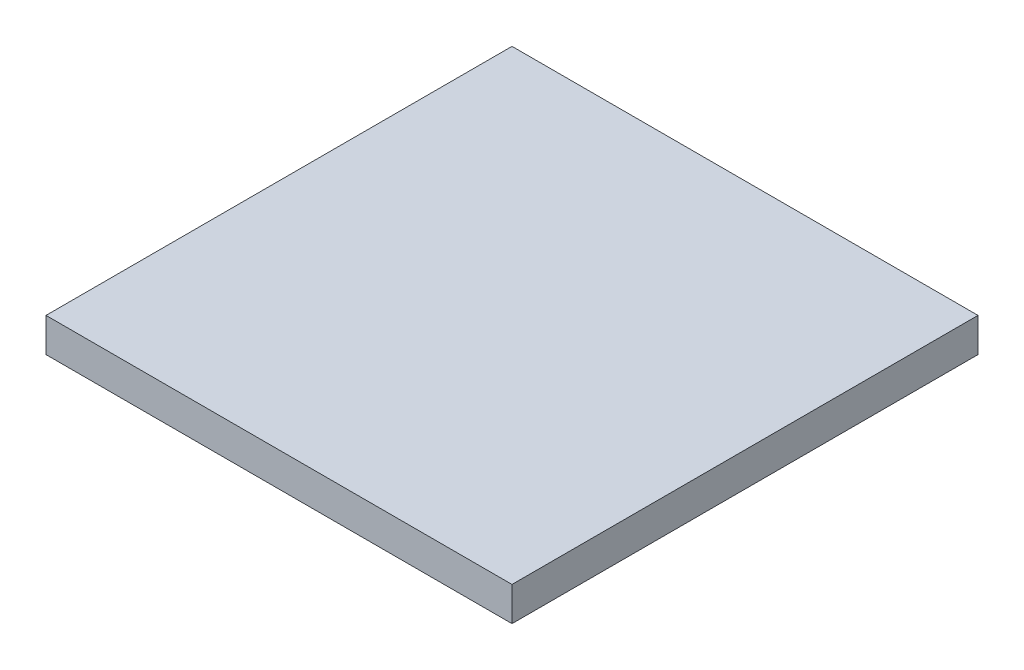
ISO-10303-21;
HEADER;
FILE_DESCRIPTION(('STEP AP214'),'2;1');
FILE_NAME('part.step','',(''),(''),'','','');
FILE_SCHEMA(('AUTOMOTIVE_DESIGN { 1 0 10303 214 1 1 1 1 }'));
ENDSEC;
DATA;
#1=APPLICATION_CONTEXT('core data for automotive mechanical design processes');
#2=APPLICATION_PROTOCOL_DEFINITION('international standard','automotive_design',2000,#1);
#3=PRODUCT_CONTEXT('',#1,'mechanical');
#4=PRODUCT('Part','Part','',(#3));
#5=PRODUCT_RELATED_PRODUCT_CATEGORY('part','',(#4));
#6=PRODUCT_DEFINITION_FORMATION('','',#4);
#7=PRODUCT_DEFINITION_CONTEXT('part definition',#1,'design');
#8=PRODUCT_DEFINITION('design','',#6,#7);
#9=PRODUCT_DEFINITION_SHAPE('','',#8);
#10=(LENGTH_UNIT() NAMED_UNIT(*) SI_UNIT(.MILLI.,.METRE.));
#11=(NAMED_UNIT(*) PLANE_ANGLE_UNIT() SI_UNIT($,.RADIAN.));
#12=(NAMED_UNIT(*) SI_UNIT($,.STERADIAN.) SOLID_ANGLE_UNIT());
#13=UNCERTAINTY_MEASURE_WITH_UNIT(LENGTH_MEASURE(1.E-05),#10,'distance_accuracy_value','');
#14=(GEOMETRIC_REPRESENTATION_CONTEXT(3) GLOBAL_UNCERTAINTY_ASSIGNED_CONTEXT((#13)) GLOBAL_UNIT_ASSIGNED_CONTEXT((#10,
#11,#12)) REPRESENTATION_CONTEXT('',''));
#15=CARTESIAN_POINT('',(0.,0.,0.));
#16=DIRECTION('',(0.,0.,1.));
#17=DIRECTION('',(1.,0.,0.));
#18=AXIS2_PLACEMENT_3D('',#15,#16,#17);
#19=CARTESIAN_POINT('',(-76.2,-5.55625,76.2));
#20=DIRECTION('',(1.,0.,0.));
#21=DIRECTION('',(0.,0.,-1.));
#22=AXIS2_PLACEMENT_3D('',#19,#20,#21);
#23=PLANE('',#22);
#24=DIRECTION('',(0.,-1.,0.));
#25=VECTOR('',#24,1.);
#26=CARTESIAN_POINT('',(-76.2,-5.55625,-76.2));
#27=LINE('',#26,#25);
#28=CARTESIAN_POINT('',(-76.2,5.55625,-76.2));
#29=VERTEX_POINT('',#28);
#30=CARTESIAN_POINT('',(-76.2,-5.55625,-76.2));
#31=VERTEX_POINT('',#30);
#32=EDGE_CURVE('E99',#29,#31,#27,.T.);
#33=ORIENTED_EDGE('',*,*,#32,.T.);
#34=DIRECTION('',(0.,0.,-1.));
#35=VECTOR('',#34,1.);
#36=CARTESIAN_POINT('',(-76.2,-5.55625,76.2));
#37=LINE('',#36,#35);
#38=CARTESIAN_POINT('',(-76.2,-5.55625,76.2));
#39=VERTEX_POINT('',#38);
#40=EDGE_CURVE('E11',#39,#31,#37,.T.);
#41=ORIENTED_EDGE('',*,*,#40,.F.);
#42=DIRECTION('',(0.,-1.,0.));
#43=VECTOR('',#42,1.);
#44=CARTESIAN_POINT('',(-76.2,-5.55625,76.2));
#45=LINE('',#44,#43);
#46=CARTESIAN_POINT('',(-76.2,5.55625,76.2));
#47=VERTEX_POINT('',#46);
#48=EDGE_CURVE('E87',#47,#39,#45,.T.);
#49=ORIENTED_EDGE('',*,*,#48,.F.);
#50=DIRECTION('',(0.,0.,-1.));
#51=VECTOR('',#50,1.);
#52=CARTESIAN_POINT('',(-76.2,5.55625,76.2));
#53=LINE('',#52,#51);
#54=EDGE_CURVE('E95',#47,#29,#53,.T.);
#55=ORIENTED_EDGE('',*,*,#54,.T.);
#56=EDGE_LOOP('',(#33,#41,#49,#55));
#57=FACE_BOUND('',#56,.T.);
#58=ADVANCED_FACE('F36',(#57),#23,.F.);
#59=CARTESIAN_POINT('',(76.2,-5.55625,76.2));
#60=DIRECTION('',(0.,1.,0.));
#61=DIRECTION('',(0.,0.,1.));
#62=AXIS2_PLACEMENT_3D('',#59,#60,#61);
#63=PLANE('',#62);
#64=DIRECTION('',(1.,0.,0.));
#65=VECTOR('',#64,1.);
#66=CARTESIAN_POINT('',(76.2,-5.55625,-76.2));
#67=LINE('',#66,#65);
#68=CARTESIAN_POINT('',(76.2,-5.55625,-76.2));
#69=VERTEX_POINT('',#68);
#70=EDGE_CURVE('E91',#31,#69,#67,.T.);
#71=ORIENTED_EDGE('',*,*,#70,.T.);
#72=DIRECTION('',(0.,0.,-1.));
#73=VECTOR('',#72,1.);
#74=CARTESIAN_POINT('',(76.2,-5.55625,76.2));
#75=LINE('',#74,#73);
#76=CARTESIAN_POINT('',(76.2,-5.55625,76.2));
#77=VERTEX_POINT('',#76);
#78=EDGE_CURVE('E44',#77,#69,#75,.T.);
#79=ORIENTED_EDGE('',*,*,#78,.F.);
#80=DIRECTION('',(1.,0.,0.));
#81=VECTOR('',#80,1.);
#82=CARTESIAN_POINT('',(76.2,-5.55625,76.2));
#83=LINE('',#82,#81);
#84=EDGE_CURVE('E82',#39,#77,#83,.T.);
#85=ORIENTED_EDGE('',*,*,#84,.F.);
#86=ORIENTED_EDGE('',*,*,#40,.T.);
#87=EDGE_LOOP('',(#71,#79,#85,#86));
#88=FACE_BOUND('',#87,.T.);
#89=ADVANCED_FACE('F90',(#88),#63,.F.);
#90=CARTESIAN_POINT('',(76.2,5.55625,76.2));
#91=DIRECTION('',(-1.,0.,0.));
#92=DIRECTION('',(0.,0.,1.));
#93=AXIS2_PLACEMENT_3D('',#90,#91,#92);
#94=PLANE('',#93);
#95=DIRECTION('',(0.,1.,0.));
#96=VECTOR('',#95,1.);
#97=CARTESIAN_POINT('',(76.2,5.55625,-76.2));
#98=LINE('',#97,#96);
#99=CARTESIAN_POINT('',(76.2,5.55625,-76.2));
#100=VERTEX_POINT('',#99);
#101=EDGE_CURVE('E69',#69,#100,#98,.T.);
#102=ORIENTED_EDGE('',*,*,#101,.T.);
#103=DIRECTION('',(0.,0.,-1.));
#104=VECTOR('',#103,1.);
#105=CARTESIAN_POINT('',(76.2,5.55625,76.2));
#106=LINE('',#105,#104);
#107=CARTESIAN_POINT('',(76.2,5.55625,76.2));
#108=VERTEX_POINT('',#107);
#109=EDGE_CURVE('E92',#108,#100,#106,.T.);
#110=ORIENTED_EDGE('',*,*,#109,.F.);
#111=DIRECTION('',(0.,1.,0.));
#112=VECTOR('',#111,1.);
#113=CARTESIAN_POINT('',(76.2,5.55625,76.2));
#114=LINE('',#113,#112);
#115=EDGE_CURVE('E85',#77,#108,#114,.T.);
#116=ORIENTED_EDGE('',*,*,#115,.F.);
#117=ORIENTED_EDGE('',*,*,#78,.T.);
#118=EDGE_LOOP('',(#102,#110,#116,#117));
#119=FACE_BOUND('',#118,.T.);
#120=ADVANCED_FACE('F93',(#119),#94,.F.);
#121=CARTESIAN_POINT('',(-76.2,5.55625,76.2));
#122=DIRECTION('',(0.,-1.,0.));
#123=DIRECTION('',(0.,0.,-1.));
#124=AXIS2_PLACEMENT_3D('',#121,#122,#123);
#125=PLANE('',#124);
#126=DIRECTION('',(-1.,0.,0.));
#127=VECTOR('',#126,1.);
#128=CARTESIAN_POINT('',(-76.2,5.55625,-76.2));
#129=LINE('',#128,#127);
#130=EDGE_CURVE('E75',#100,#29,#129,.T.);
#131=ORIENTED_EDGE('',*,*,#130,.T.);
#132=ORIENTED_EDGE('',*,*,#54,.F.);
#133=DIRECTION('',(-1.,0.,0.));
#134=VECTOR('',#133,1.);
#135=CARTESIAN_POINT('',(-76.2,5.55625,76.2));
#136=LINE('',#135,#134);
#137=EDGE_CURVE('E52',#108,#47,#136,.T.);
#138=ORIENTED_EDGE('',*,*,#137,.F.);
#139=ORIENTED_EDGE('',*,*,#109,.T.);
#140=EDGE_LOOP('',(#131,#132,#138,#139));
#141=FACE_BOUND('',#140,.T.);
#142=ADVANCED_FACE('F106',(#141),#125,.F.);
#143=CARTESIAN_POINT('',(0.,0.,76.2));
#144=DIRECTION('',(0.,0.,-1.));
#145=DIRECTION('',(-1.,0.,0.));
#146=AXIS2_PLACEMENT_3D('',#143,#144,#145);
#147=PLANE('',#146);
#148=ORIENTED_EDGE('',*,*,#48,.T.);
#149=ORIENTED_EDGE('',*,*,#84,.T.);
#150=ORIENTED_EDGE('',*,*,#115,.T.);
#151=ORIENTED_EDGE('',*,*,#137,.T.);
#152=EDGE_LOOP('',(#148,#149,#150,#151));
#153=FACE_BOUND('',#152,.T.);
#154=ADVANCED_FACE('F83',(#153),#147,.F.);
#155=CARTESIAN_POINT('',(0.,0.,-76.2));
#156=DIRECTION('',(0.,0.,-1.));
#157=DIRECTION('',(-1.,0.,0.));
#158=AXIS2_PLACEMENT_3D('',#155,#156,#157);
#159=PLANE('',#158);
#160=ORIENTED_EDGE('',*,*,#32,.F.);
#161=ORIENTED_EDGE('',*,*,#130,.F.);
#162=ORIENTED_EDGE('',*,*,#101,.F.);
#163=ORIENTED_EDGE('',*,*,#70,.F.);
#164=EDGE_LOOP('',(#160,#161,#162,#163));
#165=FACE_BOUND('',#164,.T.);
#166=ADVANCED_FACE('F109',(#165),#159,.T.);
#167=CLOSED_SHELL('',(#58,#89,#120,#142,#154,#166));
#168=MANIFOLD_SOLID_BREP('B2',#167);
#169=ADVANCED_BREP_SHAPE_REPRESENTATION('',(#18,#168),#14);
#170=SHAPE_DEFINITION_REPRESENTATION(#9,#169);
ENDSEC;
END-ISO-10303-21;
